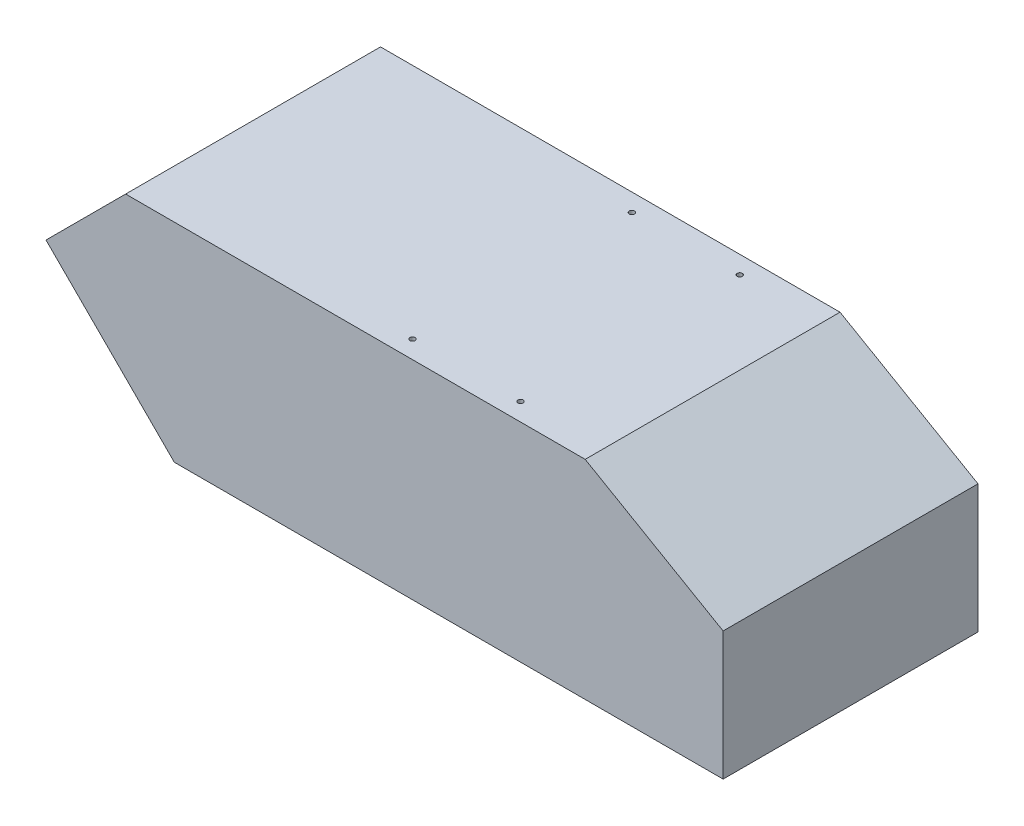
ISO-10303-21;
HEADER;
FILE_DESCRIPTION(('STEP AP214'),'2;1');
FILE_NAME('part.step','',(''),(''),'','','');
FILE_SCHEMA(('AUTOMOTIVE_DESIGN { 1 0 10303 214 1 1 1 1 }'));
ENDSEC;
DATA;
#1=APPLICATION_CONTEXT('core data for automotive mechanical design processes');
#2=APPLICATION_PROTOCOL_DEFINITION('international standard','automotive_design',2000,#1);
#3=PRODUCT_CONTEXT('',#1,'mechanical');
#4=PRODUCT('Part','Part','',(#3));
#5=PRODUCT_RELATED_PRODUCT_CATEGORY('part','',(#4));
#6=PRODUCT_DEFINITION_FORMATION('','',#4);
#7=PRODUCT_DEFINITION_CONTEXT('part definition',#1,'design');
#8=PRODUCT_DEFINITION('design','',#6,#7);
#9=PRODUCT_DEFINITION_SHAPE('','',#8);
#10=(LENGTH_UNIT() NAMED_UNIT(*) SI_UNIT(.MILLI.,.METRE.));
#11=(NAMED_UNIT(*) PLANE_ANGLE_UNIT() SI_UNIT($,.RADIAN.));
#12=(NAMED_UNIT(*) SI_UNIT($,.STERADIAN.) SOLID_ANGLE_UNIT());
#13=UNCERTAINTY_MEASURE_WITH_UNIT(LENGTH_MEASURE(1.E-05),#10,'distance_accuracy_value','');
#14=(GEOMETRIC_REPRESENTATION_CONTEXT(3) GLOBAL_UNCERTAINTY_ASSIGNED_CONTEXT((#13)) GLOBAL_UNIT_ASSIGNED_CONTEXT((#10,
#11,#12)) REPRESENTATION_CONTEXT('',''));
#15=CARTESIAN_POINT('',(0.,0.,0.));
#16=DIRECTION('',(0.,0.,1.));
#17=DIRECTION('',(1.,0.,0.));
#18=AXIS2_PLACEMENT_3D('',#15,#16,#17);
#19=CARTESIAN_POINT('',(-505.64,0.,160.));
#20=DIRECTION('',(0.707106781186549,0.707106781186546,0.));
#21=DIRECTION('',(-0.707106781186546,0.707106781186549,0.));
#22=AXIS2_PLACEMENT_3D('',#19,#20,#21);
#23=PLANE('',#22);
#24=DIRECTION('',(0.707106781186546,-0.707106781186549,0.));
#25=VECTOR('',#24,1.);
#26=CARTESIAN_POINT('',(-505.64,0.,-160.));
#27=LINE('',#26,#25);
#28=CARTESIAN_POINT('',(-505.64,0.,-160.));
#29=VERTEX_POINT('',#28);
#30=CARTESIAN_POINT('',(-344.53,-161.11,-160.));
#31=VERTEX_POINT('',#30);
#32=EDGE_CURVE('E120',#29,#31,#27,.T.);
#33=ORIENTED_EDGE('',*,*,#32,.T.);
#34=DIRECTION('',(0.,0.,-1.));
#35=VECTOR('',#34,1.);
#36=CARTESIAN_POINT('',(-344.53,-161.11,160.));
#37=LINE('',#36,#35);
#38=CARTESIAN_POINT('',(-344.53,-161.11,160.));
#39=VERTEX_POINT('',#38);
#40=EDGE_CURVE('E11',#39,#31,#37,.T.);
#41=ORIENTED_EDGE('',*,*,#40,.F.);
#42=DIRECTION('',(0.707106781186546,-0.707106781186549,0.));
#43=VECTOR('',#42,1.);
#44=CARTESIAN_POINT('',(-505.64,0.,160.));
#45=LINE('',#44,#43);
#46=CARTESIAN_POINT('',(-505.64,0.,160.));
#47=VERTEX_POINT('',#46);
#48=EDGE_CURVE('E131',#47,#39,#45,.T.);
#49=ORIENTED_EDGE('',*,*,#48,.F.);
#50=DIRECTION('',(0.,0.,-1.));
#51=VECTOR('',#50,1.);
#52=CARTESIAN_POINT('',(-505.64,0.,160.));
#53=LINE('',#52,#51);
#54=EDGE_CURVE('E116',#47,#29,#53,.T.);
#55=ORIENTED_EDGE('',*,*,#54,.T.);
#56=EDGE_LOOP('',(#33,#41,#49,#55));
#57=FACE_BOUND('',#56,.T.);
#58=ADVANCED_FACE('F33',(#57),#23,.F.);
#59=CARTESIAN_POINT('',(-344.53,-161.11,160.));
#60=DIRECTION('',(0.,1.,0.));
#61=DIRECTION('',(-1.,0.,0.));
#62=AXIS2_PLACEMENT_3D('',#59,#60,#61);
#63=PLANE('',#62);
#64=DIRECTION('',(1.,0.,0.));
#65=VECTOR('',#64,1.);
#66=CARTESIAN_POINT('',(-344.53,-161.11,-160.));
#67=LINE('',#66,#65);
#68=CARTESIAN_POINT('',(344.53,-161.11,-160.));
#69=VERTEX_POINT('',#68);
#70=EDGE_CURVE('E123',#31,#69,#67,.T.);
#71=ORIENTED_EDGE('',*,*,#70,.T.);
#72=DIRECTION('',(0.,0.,-1.));
#73=VECTOR('',#72,1.);
#74=CARTESIAN_POINT('',(344.53,-161.11,160.));
#75=LINE('',#74,#73);
#76=CARTESIAN_POINT('',(344.53,-161.11,160.));
#77=VERTEX_POINT('',#76);
#78=EDGE_CURVE('E41',#77,#69,#75,.T.);
#79=ORIENTED_EDGE('',*,*,#78,.F.);
#80=DIRECTION('',(1.,0.,0.));
#81=VECTOR('',#80,1.);
#82=CARTESIAN_POINT('',(-344.53,-161.11,160.));
#83=LINE('',#82,#81);
#84=EDGE_CURVE('E87',#39,#77,#83,.T.);
#85=ORIENTED_EDGE('',*,*,#84,.F.);
#86=ORIENTED_EDGE('',*,*,#40,.T.);
#87=EDGE_LOOP('',(#71,#79,#85,#86));
#88=FACE_BOUND('',#87,.T.);
#89=ADVANCED_FACE('F156',(#88),#63,.F.);
#90=CARTESIAN_POINT('',(344.53,-161.11,160.));
#91=DIRECTION('',(-1.,0.,0.));
#92=DIRECTION('',(0.,-1.,0.));
#93=AXIS2_PLACEMENT_3D('',#90,#91,#92);
#94=PLANE('',#93);
#95=DIRECTION('',(0.,1.,0.));
#96=VECTOR('',#95,1.);
#97=CARTESIAN_POINT('',(344.53,-161.11,-160.));
#98=LINE('',#97,#96);
#99=CARTESIAN_POINT('',(344.53,0.,-160.));
#100=VERTEX_POINT('',#99);
#101=EDGE_CURVE('E126',#69,#100,#98,.T.);
#102=ORIENTED_EDGE('',*,*,#101,.T.);
#103=DIRECTION('',(0.,0.,-1.));
#104=VECTOR('',#103,1.);
#105=CARTESIAN_POINT('',(344.53,0.,160.));
#106=LINE('',#105,#104);
#107=CARTESIAN_POINT('',(344.53,0.,160.));
#108=VERTEX_POINT('',#107);
#109=EDGE_CURVE('E111',#108,#100,#106,.T.);
#110=ORIENTED_EDGE('',*,*,#109,.F.);
#111=DIRECTION('',(0.,1.,0.));
#112=VECTOR('',#111,1.);
#113=CARTESIAN_POINT('',(344.53,-161.11,160.));
#114=LINE('',#113,#112);
#115=EDGE_CURVE('E102',#77,#108,#114,.T.);
#116=ORIENTED_EDGE('',*,*,#115,.F.);
#117=ORIENTED_EDGE('',*,*,#78,.T.);
#118=EDGE_LOOP('',(#102,#110,#116,#117));
#119=FACE_BOUND('',#118,.T.);
#120=ADVANCED_FACE('F137',(#119),#94,.F.);
#121=CARTESIAN_POINT('',(344.53,0.,160.));
#122=DIRECTION('',(-0.500000000000001,-0.866025403784438,0.));
#123=DIRECTION('',(0.866025403784438,-0.500000000000001,0.));
#124=AXIS2_PLACEMENT_3D('',#121,#122,#123);
#125=PLANE('',#124);
#126=DIRECTION('',(-0.866025403784438,0.500000000000001,0.));
#127=VECTOR('',#126,1.);
#128=CARTESIAN_POINT('',(344.53,0.,-160.));
#129=LINE('',#128,#127);
#130=CARTESIAN_POINT('',(171.324919243113,100.,-160.));
#131=VERTEX_POINT('',#130);
#132=EDGE_CURVE('E110',#100,#131,#129,.T.);
#133=ORIENTED_EDGE('',*,*,#132,.T.);
#134=DIRECTION('',(0.,0.,-1.));
#135=VECTOR('',#134,1.);
#136=CARTESIAN_POINT('',(171.324919243113,100.,160.));
#137=LINE('',#136,#135);
#138=CARTESIAN_POINT('',(171.324919243113,100.,160.));
#139=VERTEX_POINT('',#138);
#140=EDGE_CURVE('E107',#139,#131,#137,.T.);
#141=ORIENTED_EDGE('',*,*,#140,.F.);
#142=DIRECTION('',(-0.866025403784438,0.500000000000001,0.));
#143=VECTOR('',#142,1.);
#144=CARTESIAN_POINT('',(344.53,0.,160.));
#145=LINE('',#144,#143);
#146=EDGE_CURVE('E96',#108,#139,#145,.T.);
#147=ORIENTED_EDGE('',*,*,#146,.F.);
#148=ORIENTED_EDGE('',*,*,#109,.T.);
#149=EDGE_LOOP('',(#133,#141,#147,#148));
#150=FACE_BOUND('',#149,.T.);
#151=ADVANCED_FACE('F108',(#150),#125,.F.);
#152=CARTESIAN_POINT('',(171.324919243113,100.,160.));
#153=DIRECTION('',(0.,-1.,0.));
#154=DIRECTION('',(1.,0.,0.));
#155=AXIS2_PLACEMENT_3D('',#152,#153,#154);
#156=PLANE('',#155);
#157=CARTESIAN_POINT('',(-67.795,100.,-137.645));
#158=DIRECTION('',(0.,1.,0.));
#159=DIRECTION('',(0.,0.,1.));
#160=AXIS2_PLACEMENT_3D('',#157,#158,#159);
#161=CIRCLE('',#160,3.3);
#162=CARTESIAN_POINT('',(-67.795,100.,-134.345));
#163=VERTEX_POINT('',#162);
#164=EDGE_CURVE('E281',#163,#163,#161,.T.);
#165=ORIENTED_EDGE('',*,*,#164,.F.);
#166=EDGE_LOOP('',(#165));
#167=FACE_BOUND('',#166,.T.);
#168=CARTESIAN_POINT('',(67.795,100.,-137.645));
#169=DIRECTION('',(0.,1.,0.));
#170=DIRECTION('',(0.,0.,1.));
#171=AXIS2_PLACEMENT_3D('',#168,#169,#170);
#172=CIRCLE('',#171,3.3);
#173=CARTESIAN_POINT('',(67.795,100.,-134.345));
#174=VERTEX_POINT('',#173);
#175=EDGE_CURVE('E283',#174,#174,#172,.T.);
#176=ORIENTED_EDGE('',*,*,#175,.F.);
#177=EDGE_LOOP('',(#176));
#178=FACE_BOUND('',#177,.T.);
#179=CARTESIAN_POINT('',(-67.795,100.,137.645));
#180=DIRECTION('',(0.,1.,0.));
#181=DIRECTION('',(0.,0.,1.));
#182=AXIS2_PLACEMENT_3D('',#179,#180,#181);
#183=CIRCLE('',#182,3.3);
#184=CARTESIAN_POINT('',(-67.795,100.,140.945));
#185=VERTEX_POINT('',#184);
#186=EDGE_CURVE('E291',#185,#185,#183,.T.);
#187=ORIENTED_EDGE('',*,*,#186,.F.);
#188=EDGE_LOOP('',(#187));
#189=FACE_BOUND('',#188,.T.);
#190=CARTESIAN_POINT('',(67.795,100.,137.645));
#191=DIRECTION('',(0.,1.,0.));
#192=DIRECTION('',(0.,0.,1.));
#193=AXIS2_PLACEMENT_3D('',#190,#191,#192);
#194=CIRCLE('',#193,3.3);
#195=CARTESIAN_POINT('',(67.795,100.,140.945));
#196=VERTEX_POINT('',#195);
#197=EDGE_CURVE('E297',#196,#196,#194,.T.);
#198=ORIENTED_EDGE('',*,*,#197,.F.);
#199=EDGE_LOOP('',(#198));
#200=FACE_BOUND('',#199,.T.);
#201=DIRECTION('',(-1.,0.,0.));
#202=VECTOR('',#201,1.);
#203=CARTESIAN_POINT('',(171.324919243113,100.,-160.));
#204=LINE('',#203,#202);
#205=CARTESIAN_POINT('',(-405.64,100.,-160.));
#206=VERTEX_POINT('',#205);
#207=EDGE_CURVE('E73',#131,#206,#204,.T.);
#208=ORIENTED_EDGE('',*,*,#207,.T.);
#209=DIRECTION('',(0.,0.,-1.));
#210=VECTOR('',#209,1.);
#211=CARTESIAN_POINT('',(-405.64,100.,160.));
#212=LINE('',#211,#210);
#213=CARTESIAN_POINT('',(-405.64,100.,160.));
#214=VERTEX_POINT('',#213);
#215=EDGE_CURVE('E112',#214,#206,#212,.T.);
#216=ORIENTED_EDGE('',*,*,#215,.F.);
#217=DIRECTION('',(-1.,0.,0.));
#218=VECTOR('',#217,1.);
#219=CARTESIAN_POINT('',(171.324919243113,100.,160.));
#220=LINE('',#219,#218);
#221=EDGE_CURVE('E100',#139,#214,#220,.T.);
#222=ORIENTED_EDGE('',*,*,#221,.F.);
#223=ORIENTED_EDGE('',*,*,#140,.T.);
#224=EDGE_LOOP('',(#208,#216,#222,#223));
#225=FACE_BOUND('',#224,.T.);
#226=ADVANCED_FACE('F114',(#167,#178,#189,#200,#225),#156,.F.);
#227=CARTESIAN_POINT('',(-405.64,100.,160.));
#228=DIRECTION('',(0.70710678118655,-0.707106781186545,0.));
#229=DIRECTION('',(0.707106781186545,0.70710678118655,0.));
#230=AXIS2_PLACEMENT_3D('',#227,#228,#229);
#231=PLANE('',#230);
#232=DIRECTION('',(-0.707106781186545,-0.70710678118655,0.));
#233=VECTOR('',#232,1.);
#234=CARTESIAN_POINT('',(-405.64,100.,-160.));
#235=LINE('',#234,#233);
#236=EDGE_CURVE('E79',#206,#29,#235,.T.);
#237=ORIENTED_EDGE('',*,*,#236,.T.);
#238=ORIENTED_EDGE('',*,*,#54,.F.);
#239=DIRECTION('',(-0.707106781186545,-0.70710678118655,0.));
#240=VECTOR('',#239,1.);
#241=CARTESIAN_POINT('',(-405.64,100.,160.));
#242=LINE('',#241,#240);
#243=EDGE_CURVE('E49',#214,#47,#242,.T.);
#244=ORIENTED_EDGE('',*,*,#243,.F.);
#245=ORIENTED_EDGE('',*,*,#215,.T.);
#246=EDGE_LOOP('',(#237,#238,#244,#245));
#247=FACE_BOUND('',#246,.T.);
#248=ADVANCED_FACE('F144',(#247),#231,.F.);
#249=CARTESIAN_POINT('',(0.,0.,160.));
#250=DIRECTION('',(0.,0.,-1.));
#251=DIRECTION('',(-1.,0.,0.));
#252=AXIS2_PLACEMENT_3D('',#249,#250,#251);
#253=PLANE('',#252);
#254=ORIENTED_EDGE('',*,*,#48,.T.);
#255=ORIENTED_EDGE('',*,*,#84,.T.);
#256=ORIENTED_EDGE('',*,*,#115,.T.);
#257=ORIENTED_EDGE('',*,*,#146,.T.);
#258=ORIENTED_EDGE('',*,*,#221,.T.);
#259=ORIENTED_EDGE('',*,*,#243,.T.);
#260=EDGE_LOOP('',(#254,#255,#256,#257,#258,#259));
#261=FACE_BOUND('',#260,.T.);
#262=ADVANCED_FACE('F98',(#261),#253,.F.);
#263=CARTESIAN_POINT('',(0.,0.,-160.));
#264=DIRECTION('',(0.,0.,-1.));
#265=DIRECTION('',(-1.,0.,0.));
#266=AXIS2_PLACEMENT_3D('',#263,#264,#265);
#267=PLANE('',#266);
#268=ORIENTED_EDGE('',*,*,#32,.F.);
#269=ORIENTED_EDGE('',*,*,#236,.F.);
#270=ORIENTED_EDGE('',*,*,#207,.F.);
#271=ORIENTED_EDGE('',*,*,#132,.F.);
#272=ORIENTED_EDGE('',*,*,#101,.F.);
#273=ORIENTED_EDGE('',*,*,#70,.F.);
#274=EDGE_LOOP('',(#268,#269,#270,#271,#272,#273));
#275=FACE_BOUND('',#274,.T.);
#276=ADVANCED_FACE('F140',(#275),#267,.T.);
#277=CARTESIAN_POINT('',(67.795,78.,137.645));
#278=DIRECTION('',(0.,1.,0.));
#279=DIRECTION('',(0.,0.,1.));
#280=AXIS2_PLACEMENT_3D('',#277,#278,#279);
#281=CONICAL_SURFACE('',#280,3.3,1.02974425867665);
#282=CARTESIAN_POINT('',(67.795,76.0171599572091,137.645));
#283=VERTEX_POINT('',#282);
#284=VERTEX_LOOP('',#283);
#285=FACE_BOUND('',#284,.T.);
#286=CARTESIAN_POINT('',(67.795,78.,137.645));
#287=DIRECTION('',(0.,1.,0.));
#288=DIRECTION('',(0.,0.,1.));
#289=AXIS2_PLACEMENT_3D('',#286,#287,#288);
#290=CIRCLE('',#289,3.3);
#291=CARTESIAN_POINT('',(67.795,78.,140.945));
#292=VERTEX_POINT('',#291);
#293=EDGE_CURVE('E124',#292,#292,#290,.T.);
#294=ORIENTED_EDGE('',*,*,#293,.T.);
#295=EDGE_LOOP('',(#294));
#296=FACE_BOUND('',#295,.T.);
#297=ADVANCED_FACE('F185',(#285,#296),#281,.F.);
#298=CARTESIAN_POINT('',(67.795,100.,137.645));
#299=DIRECTION('',(0.,1.,0.));
#300=DIRECTION('',(0.,0.,1.));
#301=AXIS2_PLACEMENT_3D('',#298,#299,#300);
#302=CYLINDRICAL_SURFACE('',#301,3.3);
#303=ORIENTED_EDGE('',*,*,#293,.F.);
#304=EDGE_LOOP('',(#303));
#305=FACE_BOUND('',#304,.T.);
#306=ORIENTED_EDGE('',*,*,#197,.T.);
#307=EDGE_LOOP('',(#306));
#308=FACE_BOUND('',#307,.T.);
#309=ADVANCED_FACE('F190',(#305,#308),#302,.F.);
#310=CARTESIAN_POINT('',(-67.795,78.0000000000001,137.645));
#311=DIRECTION('',(0.,1.,0.));
#312=DIRECTION('',(0.,0.,1.));
#313=AXIS2_PLACEMENT_3D('',#310,#311,#312);
#314=CONICAL_SURFACE('',#313,3.3,1.02974425867665);
#315=CARTESIAN_POINT('',(-67.795,76.0171599572091,137.645));
#316=VERTEX_POINT('',#315);
#317=VERTEX_LOOP('',#316);
#318=FACE_BOUND('',#317,.T.);
#319=CARTESIAN_POINT('',(-67.795,78.0000000000001,137.645));
#320=DIRECTION('',(0.,1.,0.));
#321=DIRECTION('',(0.,0.,1.));
#322=AXIS2_PLACEMENT_3D('',#319,#320,#321);
#323=CIRCLE('',#322,3.3);
#324=CARTESIAN_POINT('',(-67.795,78.0000000000001,140.945));
#325=VERTEX_POINT('',#324);
#326=EDGE_CURVE('E294',#325,#325,#323,.T.);
#327=ORIENTED_EDGE('',*,*,#326,.T.);
#328=EDGE_LOOP('',(#327));
#329=FACE_BOUND('',#328,.T.);
#330=ADVANCED_FACE('F200',(#318,#329),#314,.F.);
#331=CARTESIAN_POINT('',(-67.795,100.,137.645));
#332=DIRECTION('',(0.,1.,0.));
#333=DIRECTION('',(0.,0.,1.));
#334=AXIS2_PLACEMENT_3D('',#331,#332,#333);
#335=CYLINDRICAL_SURFACE('',#334,3.3);
#336=ORIENTED_EDGE('',*,*,#326,.F.);
#337=EDGE_LOOP('',(#336));
#338=FACE_BOUND('',#337,.T.);
#339=ORIENTED_EDGE('',*,*,#186,.T.);
#340=EDGE_LOOP('',(#339));
#341=FACE_BOUND('',#340,.T.);
#342=ADVANCED_FACE('F210',(#338,#341),#335,.F.);
#343=CARTESIAN_POINT('',(67.795,78.,-137.645));
#344=DIRECTION('',(0.,1.,0.));
#345=DIRECTION('',(0.,0.,1.));
#346=AXIS2_PLACEMENT_3D('',#343,#344,#345);
#347=CONICAL_SURFACE('',#346,3.3,1.02974425867665);
#348=CARTESIAN_POINT('',(67.795,76.0171599572091,-137.645));
#349=VERTEX_POINT('',#348);
#350=VERTEX_LOOP('',#349);
#351=FACE_BOUND('',#350,.T.);
#352=CARTESIAN_POINT('',(67.795,78.,-137.645));
#353=DIRECTION('',(0.,1.,0.));
#354=DIRECTION('',(0.,0.,1.));
#355=AXIS2_PLACEMENT_3D('',#352,#353,#354);
#356=CIRCLE('',#355,3.3);
#357=CARTESIAN_POINT('',(67.795,78.,-134.345));
#358=VERTEX_POINT('',#357);
#359=EDGE_CURVE('E288',#358,#358,#356,.T.);
#360=ORIENTED_EDGE('',*,*,#359,.T.);
#361=EDGE_LOOP('',(#360));
#362=FACE_BOUND('',#361,.T.);
#363=ADVANCED_FACE('F220',(#351,#362),#347,.F.);
#364=CARTESIAN_POINT('',(67.795,100.,-137.645));
#365=DIRECTION('',(0.,1.,0.));
#366=DIRECTION('',(0.,0.,1.));
#367=AXIS2_PLACEMENT_3D('',#364,#365,#366);
#368=CYLINDRICAL_SURFACE('',#367,3.3);
#369=ORIENTED_EDGE('',*,*,#359,.F.);
#370=EDGE_LOOP('',(#369));
#371=FACE_BOUND('',#370,.T.);
#372=ORIENTED_EDGE('',*,*,#175,.T.);
#373=EDGE_LOOP('',(#372));
#374=FACE_BOUND('',#373,.T.);
#375=ADVANCED_FACE('F230',(#371,#374),#368,.F.);
#376=CARTESIAN_POINT('',(-67.795,78.0000000000001,-137.645));
#377=DIRECTION('',(0.,1.,0.));
#378=DIRECTION('',(0.,0.,1.));
#379=AXIS2_PLACEMENT_3D('',#376,#377,#378);
#380=CONICAL_SURFACE('',#379,3.3,1.02974425867665);
#381=CARTESIAN_POINT('',(-67.795,76.0171599572091,-137.645));
#382=VERTEX_POINT('',#381);
#383=VERTEX_LOOP('',#382);
#384=FACE_BOUND('',#383,.T.);
#385=CARTESIAN_POINT('',(-67.795,78.0000000000001,-137.645));
#386=DIRECTION('',(0.,1.,0.));
#387=DIRECTION('',(0.,0.,1.));
#388=AXIS2_PLACEMENT_3D('',#385,#386,#387);
#389=CIRCLE('',#388,3.3);
#390=CARTESIAN_POINT('',(-67.795,78.0000000000001,-134.345));
#391=VERTEX_POINT('',#390);
#392=EDGE_CURVE('E278',#391,#391,#389,.T.);
#393=ORIENTED_EDGE('',*,*,#392,.T.);
#394=EDGE_LOOP('',(#393));
#395=FACE_BOUND('',#394,.T.);
#396=ADVANCED_FACE('F240',(#384,#395),#380,.F.);
#397=CARTESIAN_POINT('',(-67.795,100.,-137.645));
#398=DIRECTION('',(0.,1.,0.));
#399=DIRECTION('',(0.,0.,1.));
#400=AXIS2_PLACEMENT_3D('',#397,#398,#399);
#401=CYLINDRICAL_SURFACE('',#400,3.3);
#402=ORIENTED_EDGE('',*,*,#392,.F.);
#403=EDGE_LOOP('',(#402));
#404=FACE_BOUND('',#403,.T.);
#405=ORIENTED_EDGE('',*,*,#164,.T.);
#406=EDGE_LOOP('',(#405));
#407=FACE_BOUND('',#406,.T.);
#408=ADVANCED_FACE('F250',(#404,#407),#401,.F.);
#409=CLOSED_SHELL('',(#58,#89,#120,#151,#226,#248,#262,#276,#297,#309,#330,#342,#363,#375,#396,#408));
#410=MANIFOLD_SOLID_BREP('B2',#409);
#411=ADVANCED_BREP_SHAPE_REPRESENTATION('',(#18,#410),#14);
#412=SHAPE_DEFINITION_REPRESENTATION(#9,#411);
ENDSEC;
END-ISO-10303-21;
